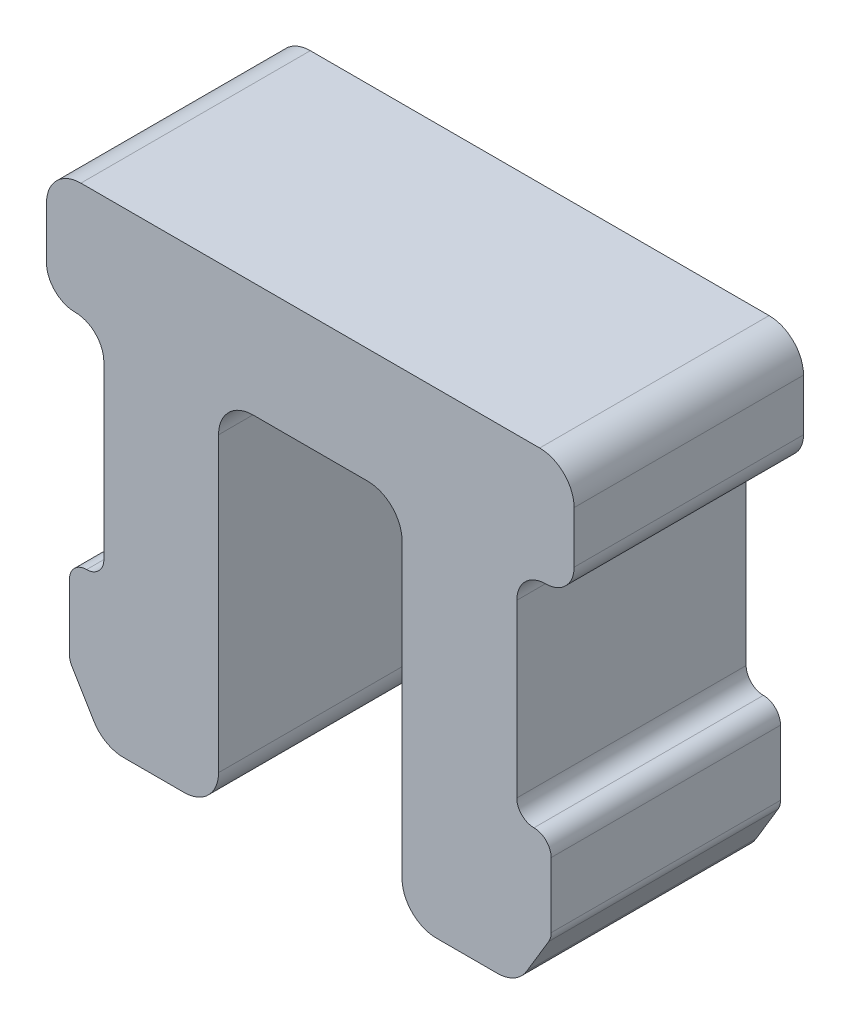
ISO-10303-21;
HEADER;
FILE_DESCRIPTION(('STEP AP214'),'2;1');
FILE_NAME('part.step','',(''),(''),'','','');
FILE_SCHEMA(('AUTOMOTIVE_DESIGN { 1 0 10303 214 1 1 1 1 }'));
ENDSEC;
DATA;
#1=APPLICATION_CONTEXT('core data for automotive mechanical design processes');
#2=APPLICATION_PROTOCOL_DEFINITION('international standard','automotive_design',2000,#1);
#3=PRODUCT_CONTEXT('',#1,'mechanical');
#4=PRODUCT('Part','Part','',(#3));
#5=PRODUCT_RELATED_PRODUCT_CATEGORY('part','',(#4));
#6=PRODUCT_DEFINITION_FORMATION('','',#4);
#7=PRODUCT_DEFINITION_CONTEXT('part definition',#1,'design');
#8=PRODUCT_DEFINITION('design','',#6,#7);
#9=PRODUCT_DEFINITION_SHAPE('','',#8);
#10=(LENGTH_UNIT() NAMED_UNIT(*) SI_UNIT(.MILLI.,.METRE.));
#11=(NAMED_UNIT(*) PLANE_ANGLE_UNIT() SI_UNIT($,.RADIAN.));
#12=(NAMED_UNIT(*) SI_UNIT($,.STERADIAN.) SOLID_ANGLE_UNIT());
#13=UNCERTAINTY_MEASURE_WITH_UNIT(LENGTH_MEASURE(1.E-05),#10,'distance_accuracy_value','');
#14=(GEOMETRIC_REPRESENTATION_CONTEXT(3) GLOBAL_UNCERTAINTY_ASSIGNED_CONTEXT((#13)) GLOBAL_UNIT_ASSIGNED_CONTEXT((#10,
#11,#12)) REPRESENTATION_CONTEXT('',''));
#15=CARTESIAN_POINT('',(0.,0.,0.));
#16=DIRECTION('',(0.,0.,1.));
#17=DIRECTION('',(1.,0.,0.));
#18=AXIS2_PLACEMENT_3D('',#15,#16,#17);
#19=CARTESIAN_POINT('',(-23.,0.,20.));
#20=DIRECTION('',(1.,0.,0.));
#21=DIRECTION('',(0.,1.,0.));
#22=AXIS2_PLACEMENT_3D('',#19,#20,#21);
#23=PLANE('',#22);
#24=DIRECTION('',(0.,-1.,0.));
#25=VECTOR('',#24,1.);
#26=CARTESIAN_POINT('',(-23.,0.,0.));
#27=LINE('',#26,#25);
#28=CARTESIAN_POINT('',(-23.,-3.,0.));
#29=VERTEX_POINT('',#28);
#30=CARTESIAN_POINT('',(-23.,-7.5,0.));
#31=VERTEX_POINT('',#30);
#32=EDGE_CURVE('E393',#29,#31,#27,.T.);
#33=ORIENTED_EDGE('',*,*,#32,.T.);
#34=DIRECTION('',(0.,0.,-1.));
#35=VECTOR('',#34,1.);
#36=CARTESIAN_POINT('',(-23.,-7.5,20.));
#37=LINE('',#36,#35);
#38=CARTESIAN_POINT('',(-23.,-7.5,20.));
#39=VERTEX_POINT('',#38);
#40=EDGE_CURVE('E430',#31,#39,#37,.F.);
#41=ORIENTED_EDGE('',*,*,#40,.T.);
#42=DIRECTION('',(0.,-1.,0.));
#43=VECTOR('',#42,1.);
#44=CARTESIAN_POINT('',(-23.,0.,20.));
#45=LINE('',#44,#43);
#46=CARTESIAN_POINT('',(-23.,-3.,20.));
#47=VERTEX_POINT('',#46);
#48=EDGE_CURVE('E292',#47,#39,#45,.T.);
#49=ORIENTED_EDGE('',*,*,#48,.F.);
#50=DIRECTION('',(0.,0.,-1.));
#51=VECTOR('',#50,1.);
#52=CARTESIAN_POINT('',(-23.,-3.,20.));
#53=LINE('',#52,#51);
#54=EDGE_CURVE('E316',#47,#29,#53,.T.);
#55=ORIENTED_EDGE('',*,*,#54,.T.);
#56=EDGE_LOOP('',(#33,#41,#49,#55));
#57=FACE_BOUND('',#56,.T.);
#58=ADVANCED_FACE('F39',(#57),#23,.F.);
#59=CARTESIAN_POINT('',(-18.,-10.,20.));
#60=DIRECTION('',(1.,0.,0.));
#61=DIRECTION('',(0.,1.,0.));
#62=AXIS2_PLACEMENT_3D('',#59,#60,#61);
#63=PLANE('',#62);
#64=DIRECTION('',(0.,-1.,0.));
#65=VECTOR('',#64,1.);
#66=CARTESIAN_POINT('',(-18.,-10.,20.));
#67=LINE('',#66,#65);
#68=CARTESIAN_POINT('',(-18.,-12.5,20.));
#69=VERTEX_POINT('',#68);
#70=CARTESIAN_POINT('',(-18.,-27.4256499190893,20.));
#71=VERTEX_POINT('',#70);
#72=EDGE_CURVE('E455',#69,#71,#67,.T.);
#73=ORIENTED_EDGE('',*,*,#72,.F.);
#74=DIRECTION('',(0.,0.,-1.));
#75=VECTOR('',#74,1.);
#76=CARTESIAN_POINT('',(-18.,-12.5,0.));
#77=LINE('',#76,#75);
#78=CARTESIAN_POINT('',(-18.,-12.5,0.));
#79=VERTEX_POINT('',#78);
#80=EDGE_CURVE('E427',#69,#79,#77,.T.);
#81=ORIENTED_EDGE('',*,*,#80,.T.);
#82=DIRECTION('',(0.,-1.,0.));
#83=VECTOR('',#82,1.);
#84=CARTESIAN_POINT('',(-18.,-10.,0.));
#85=LINE('',#84,#83);
#86=CARTESIAN_POINT('',(-18.,-27.4256499190893,0.));
#87=VERTEX_POINT('',#86);
#88=EDGE_CURVE('E451',#79,#87,#85,.T.);
#89=ORIENTED_EDGE('',*,*,#88,.T.);
#90=DIRECTION('',(0.,0.,-1.));
#91=VECTOR('',#90,1.);
#92=CARTESIAN_POINT('',(-18.,-27.4256499190893,20.));
#93=LINE('',#92,#91);
#94=EDGE_CURVE('E345',#87,#71,#93,.F.);
#95=ORIENTED_EDGE('',*,*,#94,.T.);
#96=EDGE_LOOP('',(#73,#81,#89,#95));
#97=FACE_BOUND('',#96,.T.);
#98=ADVANCED_FACE('F454',(#97),#63,.F.);
#99=CARTESIAN_POINT('',(-21.,-28.9256499190893,20.));
#100=DIRECTION('',(1.,0.,0.));
#101=DIRECTION('',(0.,1.,0.));
#102=AXIS2_PLACEMENT_3D('',#99,#100,#101);
#103=PLANE('',#102);
#104=DIRECTION('',(0.,-1.,0.));
#105=VECTOR('',#104,1.);
#106=CARTESIAN_POINT('',(-21.,-28.9256499190893,20.));
#107=LINE('',#106,#105);
#108=CARTESIAN_POINT('',(-21.,-30.4256499190893,20.));
#109=VERTEX_POINT('',#108);
#110=CARTESIAN_POINT('',(-21.,-36.0971304934058,20.));
#111=VERTEX_POINT('',#110);
#112=EDGE_CURVE('E874',#109,#111,#107,.T.);
#113=ORIENTED_EDGE('',*,*,#112,.F.);
#114=DIRECTION('',(0.,0.,-1.));
#115=VECTOR('',#114,1.);
#116=CARTESIAN_POINT('',(-21.,-30.4256499190893,20.));
#117=LINE('',#116,#115);
#118=CARTESIAN_POINT('',(-21.,-30.4256499190893,0.));
#119=VERTEX_POINT('',#118);
#120=EDGE_CURVE('E349',#109,#119,#117,.T.);
#121=ORIENTED_EDGE('',*,*,#120,.T.);
#122=DIRECTION('',(0.,-1.,0.));
#123=VECTOR('',#122,1.);
#124=CARTESIAN_POINT('',(-21.,-28.9256499190893,0.));
#125=LINE('',#124,#123);
#126=CARTESIAN_POINT('',(-21.,-36.0971304934058,0.));
#127=VERTEX_POINT('',#126);
#128=EDGE_CURVE('E456',#119,#127,#125,.T.);
#129=ORIENTED_EDGE('',*,*,#128,.T.);
#130=DIRECTION('',(0.,0.,-1.));
#131=VECTOR('',#130,1.);
#132=CARTESIAN_POINT('',(-21.,-36.0971304934058,20.));
#133=LINE('',#132,#131);
#134=EDGE_CURVE('E346',#127,#111,#133,.F.);
#135=ORIENTED_EDGE('',*,*,#134,.T.);
#136=EDGE_LOOP('',(#113,#121,#129,#135));
#137=FACE_BOUND('',#136,.T.);
#138=ADVANCED_FACE('F576',(#137),#103,.F.);
#139=CARTESIAN_POINT('',(-21.,-36.5126064408285,20.));
#140=DIRECTION('',(0.857492925712544,0.514495755427527,0.));
#141=DIRECTION('',(-0.514495755427527,0.857492925712544,0.));
#142=AXIS2_PLACEMENT_3D('',#139,#140,#141);
#143=PLANE('',#142);
#144=DIRECTION('',(0.514495755427527,-0.857492925712544,0.));
#145=VECTOR('',#144,1.);
#146=CARTESIAN_POINT('',(-21.,-36.5126064408285,0.));
#147=LINE('',#146,#145);
#148=CARTESIAN_POINT('',(-20.7862393885688,-36.8688741265471,0.));
#149=VERTEX_POINT('',#148);
#150=CARTESIAN_POINT('',(-18.8739076402304,-40.056093707111,0.));
#151=VERTEX_POINT('',#150);
#152=EDGE_CURVE('E458',#149,#151,#147,.T.);
#153=ORIENTED_EDGE('',*,*,#152,.T.);
#154=DIRECTION('',(0.,0.,-1.));
#155=VECTOR('',#154,1.);
#156=CARTESIAN_POINT('',(-18.8739076402304,-40.056093707111,20.));
#157=LINE('',#156,#155);
#158=CARTESIAN_POINT('',(-18.8739076402304,-40.056093707111,20.));
#159=VERTEX_POINT('',#158);
#160=EDGE_CURVE('E404',#151,#159,#157,.F.);
#161=ORIENTED_EDGE('',*,*,#160,.T.);
#162=DIRECTION('',(0.514495755427527,-0.857492925712544,0.));
#163=VECTOR('',#162,1.);
#164=CARTESIAN_POINT('',(-21.,-36.5126064408285,20.));
#165=LINE('',#164,#163);
#166=CARTESIAN_POINT('',(-20.7862393885688,-36.8688741265471,20.));
#167=VERTEX_POINT('',#166);
#168=EDGE_CURVE('E868',#167,#159,#165,.T.);
#169=ORIENTED_EDGE('',*,*,#168,.F.);
#170=DIRECTION('',(0.,0.,-1.));
#171=VECTOR('',#170,1.);
#172=CARTESIAN_POINT('',(-20.7862393885688,-36.8688741265471,20.));
#173=LINE('',#172,#171);
#174=EDGE_CURVE('E370',#167,#149,#173,.T.);
#175=ORIENTED_EDGE('',*,*,#174,.T.);
#176=EDGE_LOOP('',(#153,#161,#169,#175));
#177=FACE_BOUND('',#176,.T.);
#178=ADVANCED_FACE('F622',(#177),#143,.F.);
#179=CARTESIAN_POINT('',(-18.,-41.5126064408284,20.));
#180=DIRECTION('',(0.,1.,0.));
#181=DIRECTION('',(0.,0.,1.));
#182=AXIS2_PLACEMENT_3D('',#179,#180,#181);
#183=PLANE('',#182);
#184=DIRECTION('',(1.,0.,0.));
#185=VECTOR('',#184,1.);
#186=CARTESIAN_POINT('',(-18.,-41.5126064408284,20.));
#187=LINE('',#186,#185);
#188=CARTESIAN_POINT('',(-16.3014288630928,-41.5126064408284,20.));
#189=VERTEX_POINT('',#188);
#190=CARTESIAN_POINT('',(-11.,-41.5126064408284,20.));
#191=VERTEX_POINT('',#190);
#192=EDGE_CURVE('E856',#189,#191,#187,.T.);
#193=ORIENTED_EDGE('',*,*,#192,.F.);
#194=DIRECTION('',(0.,0.,-1.));
#195=VECTOR('',#194,1.);
#196=CARTESIAN_POINT('',(-16.3014288630928,-41.5126064408284,20.));
#197=LINE('',#196,#195);
#198=CARTESIAN_POINT('',(-16.3014288630928,-41.5126064408284,0.));
#199=VERTEX_POINT('',#198);
#200=EDGE_CURVE('E387',#189,#199,#197,.T.);
#201=ORIENTED_EDGE('',*,*,#200,.T.);
#202=DIRECTION('',(1.,0.,0.));
#203=VECTOR('',#202,1.);
#204=CARTESIAN_POINT('',(-18.,-41.5126064408284,0.));
#205=LINE('',#204,#203);
#206=CARTESIAN_POINT('',(-11.,-41.5126064408284,0.));
#207=VERTEX_POINT('',#206);
#208=EDGE_CURVE('E470',#199,#207,#205,.T.);
#209=ORIENTED_EDGE('',*,*,#208,.T.);
#210=DIRECTION('',(0.,0.,-1.));
#211=VECTOR('',#210,1.);
#212=CARTESIAN_POINT('',(-11.,-41.5126064408284,20.));
#213=LINE('',#212,#211);
#214=EDGE_CURVE('E317',#207,#191,#213,.F.);
#215=ORIENTED_EDGE('',*,*,#214,.T.);
#216=EDGE_LOOP('',(#193,#201,#209,#215));
#217=FACE_BOUND('',#216,.T.);
#218=ADVANCED_FACE('F627',(#217),#183,.F.);
#219=CARTESIAN_POINT('',(-7.99999999999999,-41.5126064408284,20.));
#220=DIRECTION('',(-1.,0.,0.));
#221=DIRECTION('',(0.,-1.,0.));
#222=AXIS2_PLACEMENT_3D('',#219,#220,#221);
#223=PLANE('',#222);
#224=DIRECTION('',(0.,1.,0.));
#225=VECTOR('',#224,1.);
#226=CARTESIAN_POINT('',(-7.99999999999999,-41.5126064408284,20.));
#227=LINE('',#226,#225);
#228=CARTESIAN_POINT('',(-7.99999999999999,-38.5126064408284,20.));
#229=VERTEX_POINT('',#228);
#230=CARTESIAN_POINT('',(-7.99999999999999,-13.,20.));
#231=VERTEX_POINT('',#230);
#232=EDGE_CURVE('E494',#229,#231,#227,.T.);
#233=ORIENTED_EDGE('',*,*,#232,.F.);
#234=DIRECTION('',(0.,0.,-1.));
#235=VECTOR('',#234,1.);
#236=CARTESIAN_POINT('',(-7.99999999999999,-38.5126064408284,20.));
#237=LINE('',#236,#235);
#238=CARTESIAN_POINT('',(-7.99999999999999,-38.5126064408284,0.));
#239=VERTEX_POINT('',#238);
#240=EDGE_CURVE('E312',#229,#239,#237,.T.);
#241=ORIENTED_EDGE('',*,*,#240,.T.);
#242=DIRECTION('',(0.,1.,0.));
#243=VECTOR('',#242,1.);
#244=CARTESIAN_POINT('',(-7.99999999999999,-41.5126064408284,0.));
#245=LINE('',#244,#243);
#246=CARTESIAN_POINT('',(-7.99999999999999,-13.,0.));
#247=VERTEX_POINT('',#246);
#248=EDGE_CURVE('E469',#239,#247,#245,.T.);
#249=ORIENTED_EDGE('',*,*,#248,.T.);
#250=DIRECTION('',(0.,0.,-1.));
#251=VECTOR('',#250,1.);
#252=CARTESIAN_POINT('',(-7.99999999999999,-13.,20.));
#253=LINE('',#252,#251);
#254=EDGE_CURVE('E311',#247,#231,#253,.F.);
#255=ORIENTED_EDGE('',*,*,#254,.T.);
#256=EDGE_LOOP('',(#233,#241,#249,#255));
#257=FACE_BOUND('',#256,.T.);
#258=ADVANCED_FACE('F638',(#257),#223,.F.);
#259=CARTESIAN_POINT('',(-7.99999999999999,-10.,20.));
#260=DIRECTION('',(0.,1.,0.));
#261=DIRECTION('',(-1.,0.,0.));
#262=AXIS2_PLACEMENT_3D('',#259,#260,#261);
#263=PLANE('',#262);
#264=DIRECTION('',(1.,0.,0.));
#265=VECTOR('',#264,1.);
#266=CARTESIAN_POINT('',(-7.99999999999999,-10.,20.));
#267=LINE('',#266,#265);
#268=CARTESIAN_POINT('',(-4.99999999999999,-10.,20.));
#269=VERTEX_POINT('',#268);
#270=CARTESIAN_POINT('',(5.,-10.,20.));
#271=VERTEX_POINT('',#270);
#272=EDGE_CURVE('E486',#269,#271,#267,.T.);
#273=ORIENTED_EDGE('',*,*,#272,.F.);
#274=DIRECTION('',(0.,0.,-1.));
#275=VECTOR('',#274,1.);
#276=CARTESIAN_POINT('',(-4.99999999999999,-10.,0.));
#277=LINE('',#276,#275);
#278=CARTESIAN_POINT('',(-4.99999999999999,-10.,0.));
#279=VERTEX_POINT('',#278);
#280=EDGE_CURVE('E332',#269,#279,#277,.T.);
#281=ORIENTED_EDGE('',*,*,#280,.T.);
#282=DIRECTION('',(1.,0.,0.));
#283=VECTOR('',#282,1.);
#284=CARTESIAN_POINT('',(-7.99999999999999,-10.,0.));
#285=LINE('',#284,#283);
#286=CARTESIAN_POINT('',(5.,-10.,0.));
#287=VERTEX_POINT('',#286);
#288=EDGE_CURVE('E278',#279,#287,#285,.T.);
#289=ORIENTED_EDGE('',*,*,#288,.T.);
#290=DIRECTION('',(0.,0.,-1.));
#291=VECTOR('',#290,1.);
#292=CARTESIAN_POINT('',(5.,-10.,20.));
#293=LINE('',#292,#291);
#294=EDGE_CURVE('E330',#287,#271,#293,.F.);
#295=ORIENTED_EDGE('',*,*,#294,.T.);
#296=EDGE_LOOP('',(#273,#281,#289,#295));
#297=FACE_BOUND('',#296,.T.);
#298=ADVANCED_FACE('F476',(#297),#263,.F.);
#299=CARTESIAN_POINT('',(8.00000000000001,-41.5126064408284,20.));
#300=DIRECTION('',(1.,0.,0.));
#301=DIRECTION('',(0.,1.,0.));
#302=AXIS2_PLACEMENT_3D('',#299,#300,#301);
#303=PLANE('',#302);
#304=DIRECTION('',(0.,-1.,0.));
#305=VECTOR('',#304,1.);
#306=CARTESIAN_POINT('',(8.00000000000001,-41.5126064408284,0.));
#307=LINE('',#306,#305);
#308=CARTESIAN_POINT('',(8.,-13.,0.));
#309=VERTEX_POINT('',#308);
#310=CARTESIAN_POINT('',(8.00000000000001,-38.5126064408284,0.));
#311=VERTEX_POINT('',#310);
#312=EDGE_CURVE('E273',#309,#311,#307,.T.);
#313=ORIENTED_EDGE('',*,*,#312,.T.);
#314=DIRECTION('',(0.,0.,-1.));
#315=VECTOR('',#314,1.);
#316=CARTESIAN_POINT('',(8.00000000000001,-38.5126064408284,20.));
#317=LINE('',#316,#315);
#318=CARTESIAN_POINT('',(8.00000000000001,-38.5126064408284,20.));
#319=VERTEX_POINT('',#318);
#320=EDGE_CURVE('E252',#311,#319,#317,.F.);
#321=ORIENTED_EDGE('',*,*,#320,.T.);
#322=DIRECTION('',(0.,-1.,0.));
#323=VECTOR('',#322,1.);
#324=CARTESIAN_POINT('',(8.00000000000001,-41.5126064408284,20.));
#325=LINE('',#324,#323);
#326=CARTESIAN_POINT('',(8.,-13.,20.));
#327=VERTEX_POINT('',#326);
#328=EDGE_CURVE('E487',#327,#319,#325,.T.);
#329=ORIENTED_EDGE('',*,*,#328,.F.);
#330=DIRECTION('',(0.,0.,-1.));
#331=VECTOR('',#330,1.);
#332=CARTESIAN_POINT('',(8.,-13.,0.));
#333=LINE('',#332,#331);
#334=EDGE_CURVE('E259',#327,#309,#333,.T.);
#335=ORIENTED_EDGE('',*,*,#334,.T.);
#336=EDGE_LOOP('',(#313,#321,#329,#335));
#337=FACE_BOUND('',#336,.T.);
#338=ADVANCED_FACE('F489',(#337),#303,.F.);
#339=CARTESIAN_POINT('',(18.,-41.5126064408284,20.));
#340=DIRECTION('',(0.,1.,0.));
#341=DIRECTION('',(-1.,0.,0.));
#342=AXIS2_PLACEMENT_3D('',#339,#340,#341);
#343=PLANE('',#342);
#344=DIRECTION('',(1.,0.,0.));
#345=VECTOR('',#344,1.);
#346=CARTESIAN_POINT('',(18.,-41.5126064408284,0.));
#347=LINE('',#346,#345);
#348=CARTESIAN_POINT('',(11.,-41.5126064408284,0.));
#349=VERTEX_POINT('',#348);
#350=CARTESIAN_POINT('',(16.3014288630928,-41.5126064408284,0.));
#351=VERTEX_POINT('',#350);
#352=EDGE_CURVE('E264',#349,#351,#347,.T.);
#353=ORIENTED_EDGE('',*,*,#352,.T.);
#354=DIRECTION('',(0.,0.,-1.));
#355=VECTOR('',#354,1.);
#356=CARTESIAN_POINT('',(16.3014288630928,-41.5126064408284,20.));
#357=LINE('',#356,#355);
#358=CARTESIAN_POINT('',(16.3014288630928,-41.5126064408284,20.));
#359=VERTEX_POINT('',#358);
#360=EDGE_CURVE('E414',#351,#359,#357,.F.);
#361=ORIENTED_EDGE('',*,*,#360,.T.);
#362=DIRECTION('',(1.,0.,0.));
#363=VECTOR('',#362,1.);
#364=CARTESIAN_POINT('',(18.,-41.5126064408284,20.));
#365=LINE('',#364,#363);
#366=CARTESIAN_POINT('',(11.,-41.5126064408284,20.));
#367=VERTEX_POINT('',#366);
#368=EDGE_CURVE('E266',#367,#359,#365,.T.);
#369=ORIENTED_EDGE('',*,*,#368,.F.);
#370=DIRECTION('',(0.,0.,-1.));
#371=VECTOR('',#370,1.);
#372=CARTESIAN_POINT('',(11.,-41.5126064408284,20.));
#373=LINE('',#372,#371);
#374=EDGE_CURVE('E249',#367,#349,#373,.T.);
#375=ORIENTED_EDGE('',*,*,#374,.T.);
#376=EDGE_LOOP('',(#353,#361,#369,#375));
#377=FACE_BOUND('',#376,.T.);
#378=ADVANCED_FACE('F262',(#377),#343,.F.);
#379=CARTESIAN_POINT('',(21.,-36.5126064408284,20.));
#380=DIRECTION('',(-0.857492925712544,0.514495755427527,0.));
#381=DIRECTION('',(-0.514495755427527,-0.857492925712544,0.));
#382=AXIS2_PLACEMENT_3D('',#379,#380,#381);
#383=PLANE('',#382);
#384=DIRECTION('',(0.514495755427527,0.857492925712544,0.));
#385=VECTOR('',#384,1.);
#386=CARTESIAN_POINT('',(21.,-36.5126064408284,20.));
#387=LINE('',#386,#385);
#388=CARTESIAN_POINT('',(18.8739076402305,-40.056093707111,20.));
#389=VERTEX_POINT('',#388);
#390=CARTESIAN_POINT('',(20.7862393885688,-36.8688741265471,20.));
#391=VERTEX_POINT('',#390);
#392=EDGE_CURVE('E495',#389,#391,#387,.T.);
#393=ORIENTED_EDGE('',*,*,#392,.F.);
#394=DIRECTION('',(0.,0.,-1.));
#395=VECTOR('',#394,1.);
#396=CARTESIAN_POINT('',(18.8739076402305,-40.056093707111,20.));
#397=LINE('',#396,#395);
#398=CARTESIAN_POINT('',(18.8739076402305,-40.056093707111,0.));
#399=VERTEX_POINT('',#398);
#400=EDGE_CURVE('E407',#389,#399,#397,.T.);
#401=ORIENTED_EDGE('',*,*,#400,.T.);
#402=DIRECTION('',(0.514495755427527,0.857492925712544,0.));
#403=VECTOR('',#402,1.);
#404=CARTESIAN_POINT('',(21.,-36.5126064408284,0.));
#405=LINE('',#404,#403);
#406=CARTESIAN_POINT('',(20.7862393885688,-36.8688741265471,0.));
#407=VERTEX_POINT('',#406);
#408=EDGE_CURVE('E274',#399,#407,#405,.T.);
#409=ORIENTED_EDGE('',*,*,#408,.T.);
#410=DIRECTION('',(0.,0.,-1.));
#411=VECTOR('',#410,1.);
#412=CARTESIAN_POINT('',(20.7862393885688,-36.8688741265471,20.));
#413=LINE('',#412,#411);
#414=EDGE_CURVE('E377',#407,#391,#413,.F.);
#415=ORIENTED_EDGE('',*,*,#414,.T.);
#416=EDGE_LOOP('',(#393,#401,#409,#415));
#417=FACE_BOUND('',#416,.T.);
#418=ADVANCED_FACE('F556',(#417),#383,.F.);
#419=CARTESIAN_POINT('',(21.,-28.9256499190893,20.));
#420=DIRECTION('',(-1.,0.,0.));
#421=DIRECTION('',(0.,-1.,0.));
#422=AXIS2_PLACEMENT_3D('',#419,#420,#421);
#423=PLANE('',#422);
#424=DIRECTION('',(0.,1.,0.));
#425=VECTOR('',#424,1.);
#426=CARTESIAN_POINT('',(21.,-28.9256499190893,0.));
#427=LINE('',#426,#425);
#428=CARTESIAN_POINT('',(21.,-36.0971304934058,0.));
#429=VERTEX_POINT('',#428);
#430=CARTESIAN_POINT('',(21.,-30.4256499190893,0.));
#431=VERTEX_POINT('',#430);
#432=EDGE_CURVE('E276',#429,#431,#427,.T.);
#433=ORIENTED_EDGE('',*,*,#432,.T.);
#434=DIRECTION('',(0.,0.,-1.));
#435=VECTOR('',#434,1.);
#436=CARTESIAN_POINT('',(21.,-30.4256499190893,20.));
#437=LINE('',#436,#435);
#438=CARTESIAN_POINT('',(21.,-30.4256499190893,20.));
#439=VERTEX_POINT('',#438);
#440=EDGE_CURVE('E376',#431,#439,#437,.F.);
#441=ORIENTED_EDGE('',*,*,#440,.T.);
#442=DIRECTION('',(0.,1.,0.));
#443=VECTOR('',#442,1.);
#444=CARTESIAN_POINT('',(21.,-28.9256499190893,20.));
#445=LINE('',#444,#443);
#446=CARTESIAN_POINT('',(21.,-36.0971304934058,20.));
#447=VERTEX_POINT('',#446);
#448=EDGE_CURVE('E497',#447,#439,#445,.T.);
#449=ORIENTED_EDGE('',*,*,#448,.F.);
#450=DIRECTION('',(0.,0.,-1.));
#451=VECTOR('',#450,1.);
#452=CARTESIAN_POINT('',(21.,-36.0971304934058,20.));
#453=LINE('',#452,#451);
#454=EDGE_CURVE('E373',#447,#429,#453,.T.);
#455=ORIENTED_EDGE('',*,*,#454,.T.);
#456=EDGE_LOOP('',(#433,#441,#449,#455));
#457=FACE_BOUND('',#456,.T.);
#458=ADVANCED_FACE('F550',(#457),#423,.F.);
#459=CARTESIAN_POINT('',(18.,-9.99999999999999,20.));
#460=DIRECTION('',(-1.,0.,0.));
#461=DIRECTION('',(0.,-1.,0.));
#462=AXIS2_PLACEMENT_3D('',#459,#460,#461);
#463=PLANE('',#462);
#464=DIRECTION('',(0.,1.,0.));
#465=VECTOR('',#464,1.);
#466=CARTESIAN_POINT('',(18.,-9.99999999999999,0.));
#467=LINE('',#466,#465);
#468=CARTESIAN_POINT('',(18.,-27.4256499190893,0.));
#469=VERTEX_POINT('',#468);
#470=CARTESIAN_POINT('',(18.,-12.5,0.));
#471=VERTEX_POINT('',#470);
#472=EDGE_CURVE('E285',#469,#471,#467,.T.);
#473=ORIENTED_EDGE('',*,*,#472,.T.);
#474=DIRECTION('',(0.,0.,-1.));
#475=VECTOR('',#474,1.);
#476=CARTESIAN_POINT('',(18.,-12.5,20.));
#477=LINE('',#476,#475);
#478=CARTESIAN_POINT('',(18.,-12.5,20.));
#479=VERTEX_POINT('',#478);
#480=EDGE_CURVE('E424',#471,#479,#477,.F.);
#481=ORIENTED_EDGE('',*,*,#480,.T.);
#482=DIRECTION('',(0.,1.,0.));
#483=VECTOR('',#482,1.);
#484=CARTESIAN_POINT('',(18.,-9.99999999999999,20.));
#485=LINE('',#484,#483);
#486=CARTESIAN_POINT('',(18.,-27.4256499190893,20.));
#487=VERTEX_POINT('',#486);
#488=EDGE_CURVE('E505',#487,#479,#485,.T.);
#489=ORIENTED_EDGE('',*,*,#488,.F.);
#490=DIRECTION('',(0.,0.,-1.));
#491=VECTOR('',#490,1.);
#492=CARTESIAN_POINT('',(18.,-27.4256499190893,0.));
#493=LINE('',#492,#491);
#494=EDGE_CURVE('E369',#487,#469,#493,.T.);
#495=ORIENTED_EDGE('',*,*,#494,.T.);
#496=EDGE_LOOP('',(#473,#481,#489,#495));
#497=FACE_BOUND('',#496,.T.);
#498=ADVANCED_FACE('F539',(#497),#463,.F.);
#499=CARTESIAN_POINT('',(23.,0.,20.));
#500=DIRECTION('',(-1.,0.,0.));
#501=DIRECTION('',(0.,-1.,0.));
#502=AXIS2_PLACEMENT_3D('',#499,#500,#501);
#503=PLANE('',#502);
#504=DIRECTION('',(0.,1.,0.));
#505=VECTOR('',#504,1.);
#506=CARTESIAN_POINT('',(23.,0.,20.));
#507=LINE('',#506,#505);
#508=CARTESIAN_POINT('',(23.,-7.49999999999999,20.));
#509=VERTEX_POINT('',#508);
#510=CARTESIAN_POINT('',(23.,-3.,20.));
#511=VERTEX_POINT('',#510);
#512=EDGE_CURVE('E502',#509,#511,#507,.T.);
#513=ORIENTED_EDGE('',*,*,#512,.F.);
#514=DIRECTION('',(0.,0.,-1.));
#515=VECTOR('',#514,1.);
#516=CARTESIAN_POINT('',(23.,-7.49999999999999,20.));
#517=LINE('',#516,#515);
#518=CARTESIAN_POINT('',(23.,-7.49999999999999,0.));
#519=VERTEX_POINT('',#518);
#520=EDGE_CURVE('E415',#509,#519,#517,.T.);
#521=ORIENTED_EDGE('',*,*,#520,.T.);
#522=DIRECTION('',(0.,1.,0.));
#523=VECTOR('',#522,1.);
#524=CARTESIAN_POINT('',(23.,0.,0.));
#525=LINE('',#524,#523);
#526=CARTESIAN_POINT('',(23.,-3.,0.));
#527=VERTEX_POINT('',#526);
#528=EDGE_CURVE('E289',#519,#527,#525,.T.);
#529=ORIENTED_EDGE('',*,*,#528,.T.);
#530=DIRECTION('',(0.,0.,-1.));
#531=VECTOR('',#530,1.);
#532=CARTESIAN_POINT('',(23.,-3.,20.));
#533=LINE('',#532,#531);
#534=EDGE_CURVE('E327',#527,#511,#533,.F.);
#535=ORIENTED_EDGE('',*,*,#534,.T.);
#536=EDGE_LOOP('',(#513,#521,#529,#535));
#537=FACE_BOUND('',#536,.T.);
#538=ADVANCED_FACE('F526',(#537),#503,.F.);
#539=CARTESIAN_POINT('',(23.,0.,20.));
#540=DIRECTION('',(0.,-1.,0.));
#541=DIRECTION('',(1.,0.,0.));
#542=AXIS2_PLACEMENT_3D('',#539,#540,#541);
#543=PLANE('',#542);
#544=DIRECTION('',(-1.,0.,0.));
#545=VECTOR('',#544,1.);
#546=CARTESIAN_POINT('',(23.,0.,0.));
#547=LINE('',#546,#545);
#548=CARTESIAN_POINT('',(20.,0.,0.));
#549=VERTEX_POINT('',#548);
#550=CARTESIAN_POINT('',(-20.,0.,0.));
#551=VERTEX_POINT('',#550);
#552=EDGE_CURVE('E290',#549,#551,#547,.T.);
#553=ORIENTED_EDGE('',*,*,#552,.T.);
#554=DIRECTION('',(0.,0.,-1.));
#555=VECTOR('',#554,1.);
#556=CARTESIAN_POINT('',(-20.,0.,20.));
#557=LINE('',#556,#555);
#558=CARTESIAN_POINT('',(-20.,0.,20.));
#559=VERTEX_POINT('',#558);
#560=EDGE_CURVE('E322',#551,#559,#557,.F.);
#561=ORIENTED_EDGE('',*,*,#560,.T.);
#562=DIRECTION('',(-1.,0.,0.));
#563=VECTOR('',#562,1.);
#564=CARTESIAN_POINT('',(23.,0.,20.));
#565=LINE('',#564,#563);
#566=CARTESIAN_POINT('',(20.,0.,20.));
#567=VERTEX_POINT('',#566);
#568=EDGE_CURVE('E269',#567,#559,#565,.T.);
#569=ORIENTED_EDGE('',*,*,#568,.F.);
#570=DIRECTION('',(0.,0.,-1.));
#571=VECTOR('',#570,1.);
#572=CARTESIAN_POINT('',(20.,0.,20.));
#573=LINE('',#572,#571);
#574=EDGE_CURVE('E321',#567,#549,#573,.T.);
#575=ORIENTED_EDGE('',*,*,#574,.T.);
#576=EDGE_LOOP('',(#553,#561,#569,#575));
#577=FACE_BOUND('',#576,.T.);
#578=ADVANCED_FACE('F518',(#577),#543,.F.);
#579=CARTESIAN_POINT('',(0.,0.,20.));
#580=DIRECTION('',(0.,0.,1.));
#581=DIRECTION('',(1.,0.,0.));
#582=AXIS2_PLACEMENT_3D('',#579,#580,#581);
#583=PLANE('',#582);
#584=ORIENTED_EDGE('',*,*,#488,.T.);
#585=CARTESIAN_POINT('',(20.5,-12.5,20.));
#586=DIRECTION('',(0.,0.,1.));
#587=DIRECTION('',(1.,0.,0.));
#588=AXIS2_PLACEMENT_3D('',#585,#586,#587);
#589=CIRCLE('',#588,2.5);
#590=CARTESIAN_POINT('',(20.5,-9.99999999999999,20.));
#591=VERTEX_POINT('',#590);
#592=EDGE_CURVE('E432',#479,#591,#589,.F.);
#593=ORIENTED_EDGE('',*,*,#592,.T.);
#594=CARTESIAN_POINT('',(20.5,-7.49999999999999,20.));
#595=DIRECTION('',(0.,0.,1.));
#596=DIRECTION('',(1.,0.,0.));
#597=AXIS2_PLACEMENT_3D('',#594,#595,#596);
#598=CIRCLE('',#597,2.5);
#599=EDGE_CURVE('E421',#591,#509,#598,.T.);
#600=ORIENTED_EDGE('',*,*,#599,.T.);
#601=ORIENTED_EDGE('',*,*,#512,.T.);
#602=CARTESIAN_POINT('',(20.,-3.,20.));
#603=DIRECTION('',(0.,0.,1.));
#604=DIRECTION('',(1.,0.,0.));
#605=AXIS2_PLACEMENT_3D('',#602,#603,#604);
#606=CIRCLE('',#605,3.);
#607=EDGE_CURVE('E303',#511,#567,#606,.T.);
#608=ORIENTED_EDGE('',*,*,#607,.T.);
#609=ORIENTED_EDGE('',*,*,#568,.T.);
#610=CARTESIAN_POINT('',(-20.,-3.00000000000001,20.));
#611=DIRECTION('',(0.,0.,1.));
#612=DIRECTION('',(1.,0.,0.));
#613=AXIS2_PLACEMENT_3D('',#610,#611,#612);
#614=CIRCLE('',#613,3.);
#615=EDGE_CURVE('E304',#559,#47,#614,.T.);
#616=ORIENTED_EDGE('',*,*,#615,.T.);
#617=ORIENTED_EDGE('',*,*,#48,.T.);
#618=CARTESIAN_POINT('',(-20.5,-7.5,20.));
#619=DIRECTION('',(0.,0.,1.));
#620=DIRECTION('',(1.,0.,0.));
#621=AXIS2_PLACEMENT_3D('',#618,#619,#620);
#622=CIRCLE('',#621,2.5);
#623=CARTESIAN_POINT('',(-20.5,-10.,20.));
#624=VERTEX_POINT('',#623);
#625=EDGE_CURVE('E56',#39,#624,#622,.T.);
#626=ORIENTED_EDGE('',*,*,#625,.T.);
#627=CARTESIAN_POINT('',(-20.5,-12.5,20.));
#628=DIRECTION('',(0.,0.,1.));
#629=DIRECTION('',(1.,0.,0.));
#630=AXIS2_PLACEMENT_3D('',#627,#628,#629);
#631=CIRCLE('',#630,2.5);
#632=EDGE_CURVE('E11',#624,#69,#631,.F.);
#633=ORIENTED_EDGE('',*,*,#632,.T.);
#634=ORIENTED_EDGE('',*,*,#72,.T.);
#635=CARTESIAN_POINT('',(-19.5,-27.4256499190893,20.));
#636=DIRECTION('',(0.,0.,1.));
#637=DIRECTION('',(1.,0.,0.));
#638=AXIS2_PLACEMENT_3D('',#635,#636,#637);
#639=CIRCLE('',#638,1.5);
#640=CARTESIAN_POINT('',(-19.5,-28.9256499190893,20.));
#641=VERTEX_POINT('',#640);
#642=EDGE_CURVE('E381',#71,#641,#639,.F.);
#643=ORIENTED_EDGE('',*,*,#642,.T.);
#644=CARTESIAN_POINT('',(-19.5,-30.4256499190893,20.));
#645=DIRECTION('',(0.,0.,1.));
#646=DIRECTION('',(1.,0.,0.));
#647=AXIS2_PLACEMENT_3D('',#644,#645,#646);
#648=CIRCLE('',#647,1.5);
#649=EDGE_CURVE('E362',#641,#109,#648,.T.);
#650=ORIENTED_EDGE('',*,*,#649,.T.);
#651=ORIENTED_EDGE('',*,*,#112,.T.);
#652=CARTESIAN_POINT('',(-19.5,-36.0971304934058,20.));
#653=DIRECTION('',(0.,0.,1.));
#654=DIRECTION('',(1.,0.,0.));
#655=AXIS2_PLACEMENT_3D('',#652,#653,#654);
#656=CIRCLE('',#655,1.5);
#657=EDGE_CURVE('E361',#111,#167,#656,.T.);
#658=ORIENTED_EDGE('',*,*,#657,.T.);
#659=ORIENTED_EDGE('',*,*,#168,.T.);
#660=CARTESIAN_POINT('',(-16.3014288630928,-38.5126064408284,20.));
#661=DIRECTION('',(0.,0.,1.));
#662=DIRECTION('',(1.,0.,0.));
#663=AXIS2_PLACEMENT_3D('',#660,#661,#662);
#664=CIRCLE('',#663,3.);
#665=EDGE_CURVE('E410',#159,#189,#664,.T.);
#666=ORIENTED_EDGE('',*,*,#665,.T.);
#667=ORIENTED_EDGE('',*,*,#192,.T.);
#668=CARTESIAN_POINT('',(-11.,-38.5126064408284,20.));
#669=DIRECTION('',(0.,0.,1.));
#670=DIRECTION('',(1.,0.,0.));
#671=AXIS2_PLACEMENT_3D('',#668,#669,#670);
#672=CIRCLE('',#671,3.);
#673=EDGE_CURVE('E310',#191,#229,#672,.T.);
#674=ORIENTED_EDGE('',*,*,#673,.T.);
#675=ORIENTED_EDGE('',*,*,#232,.T.);
#676=CARTESIAN_POINT('',(-4.99999999999999,-13.,20.));
#677=DIRECTION('',(0.,0.,1.));
#678=DIRECTION('',(1.,0.,0.));
#679=AXIS2_PLACEMENT_3D('',#676,#677,#678);
#680=CIRCLE('',#679,3.);
#681=EDGE_CURVE('E340',#231,#269,#680,.F.);
#682=ORIENTED_EDGE('',*,*,#681,.T.);
#683=ORIENTED_EDGE('',*,*,#272,.T.);
#684=CARTESIAN_POINT('',(5.,-13.,20.));
#685=DIRECTION('',(0.,0.,1.));
#686=DIRECTION('',(1.,0.,0.));
#687=AXIS2_PLACEMENT_3D('',#684,#685,#686);
#688=CIRCLE('',#687,3.);
#689=EDGE_CURVE('E344',#271,#327,#688,.F.);
#690=ORIENTED_EDGE('',*,*,#689,.T.);
#691=ORIENTED_EDGE('',*,*,#328,.T.);
#692=CARTESIAN_POINT('',(11.,-38.5126064408284,20.));
#693=DIRECTION('',(0.,0.,1.));
#694=DIRECTION('',(1.,0.,0.));
#695=AXIS2_PLACEMENT_3D('',#692,#693,#694);
#696=CIRCLE('',#695,3.);
#697=EDGE_CURVE('E307',#319,#367,#696,.T.);
#698=ORIENTED_EDGE('',*,*,#697,.T.);
#699=ORIENTED_EDGE('',*,*,#368,.T.);
#700=CARTESIAN_POINT('',(16.3014288630928,-38.5126064408284,20.));
#701=DIRECTION('',(0.,0.,1.));
#702=DIRECTION('',(1.,0.,0.));
#703=AXIS2_PLACEMENT_3D('',#700,#701,#702);
#704=CIRCLE('',#703,3.);
#705=EDGE_CURVE('E409',#359,#389,#704,.T.);
#706=ORIENTED_EDGE('',*,*,#705,.T.);
#707=ORIENTED_EDGE('',*,*,#392,.T.);
#708=CARTESIAN_POINT('',(19.5,-36.0971304934058,20.));
#709=DIRECTION('',(0.,0.,1.));
#710=DIRECTION('',(1.,0.,0.));
#711=AXIS2_PLACEMENT_3D('',#708,#709,#710);
#712=CIRCLE('',#711,1.5);
#713=EDGE_CURVE('E360',#391,#447,#712,.T.);
#714=ORIENTED_EDGE('',*,*,#713,.T.);
#715=ORIENTED_EDGE('',*,*,#448,.T.);
#716=CARTESIAN_POINT('',(19.5,-30.4256499190893,20.));
#717=DIRECTION('',(0.,0.,1.));
#718=DIRECTION('',(1.,0.,0.));
#719=AXIS2_PLACEMENT_3D('',#716,#717,#718);
#720=CIRCLE('',#719,1.5);
#721=CARTESIAN_POINT('',(19.5,-28.9256499190893,20.));
#722=VERTEX_POINT('',#721);
#723=EDGE_CURVE('E363',#439,#722,#720,.T.);
#724=ORIENTED_EDGE('',*,*,#723,.T.);
#725=CARTESIAN_POINT('',(19.5,-27.4256499190893,20.));
#726=DIRECTION('',(0.,0.,1.));
#727=DIRECTION('',(1.,0.,0.));
#728=AXIS2_PLACEMENT_3D('',#725,#726,#727);
#729=CIRCLE('',#728,1.5);
#730=EDGE_CURVE('E390',#722,#487,#729,.F.);
#731=ORIENTED_EDGE('',*,*,#730,.T.);
#732=EDGE_LOOP('',(#584,#593,#600,#601,#608,#609,#616,#617,#626,#633,#634,#643,#650,#651,#658,
#659,#666,#667,#674,#675,#682,#683,#690,#691,#698,#699,#706,#707,#714,#715,#724,#731));
#733=FACE_BOUND('',#732,.T.);
#734=ADVANCED_FACE('F488',(#733),#583,.T.);
#735=CARTESIAN_POINT('',(0.,0.,0.));
#736=DIRECTION('',(0.,0.,1.));
#737=DIRECTION('',(1.,0.,0.));
#738=AXIS2_PLACEMENT_3D('',#735,#736,#737);
#739=PLANE('',#738);
#740=ORIENTED_EDGE('',*,*,#528,.F.);
#741=CARTESIAN_POINT('',(20.5,-7.49999999999999,0.));
#742=DIRECTION('',(0.,0.,1.));
#743=DIRECTION('',(1.,0.,0.));
#744=AXIS2_PLACEMENT_3D('',#741,#742,#743);
#745=CIRCLE('',#744,2.5);
#746=CARTESIAN_POINT('',(20.5,-9.99999999999999,0.));
#747=VERTEX_POINT('',#746);
#748=EDGE_CURVE('E420',#519,#747,#745,.F.);
#749=ORIENTED_EDGE('',*,*,#748,.T.);
#750=CARTESIAN_POINT('',(20.5,-12.5,0.));
#751=DIRECTION('',(0.,0.,1.));
#752=DIRECTION('',(1.,0.,0.));
#753=AXIS2_PLACEMENT_3D('',#750,#751,#752);
#754=CIRCLE('',#753,2.5);
#755=EDGE_CURVE('E435',#747,#471,#754,.T.);
#756=ORIENTED_EDGE('',*,*,#755,.T.);
#757=ORIENTED_EDGE('',*,*,#472,.F.);
#758=CARTESIAN_POINT('',(19.5,-27.4256499190893,0.));
#759=DIRECTION('',(0.,0.,1.));
#760=DIRECTION('',(1.,0.,0.));
#761=AXIS2_PLACEMENT_3D('',#758,#759,#760);
#762=CIRCLE('',#761,1.5);
#763=CARTESIAN_POINT('',(19.5,-28.9256499190893,0.));
#764=VERTEX_POINT('',#763);
#765=EDGE_CURVE('E389',#469,#764,#762,.T.);
#766=ORIENTED_EDGE('',*,*,#765,.T.);
#767=CARTESIAN_POINT('',(19.5,-30.4256499190893,0.));
#768=DIRECTION('',(0.,0.,1.));
#769=DIRECTION('',(1.,0.,0.));
#770=AXIS2_PLACEMENT_3D('',#767,#768,#769);
#771=CIRCLE('',#770,1.5);
#772=EDGE_CURVE('E354',#764,#431,#771,.F.);
#773=ORIENTED_EDGE('',*,*,#772,.T.);
#774=ORIENTED_EDGE('',*,*,#432,.F.);
#775=CARTESIAN_POINT('',(19.5,-36.0971304934058,0.));
#776=DIRECTION('',(0.,0.,1.));
#777=DIRECTION('',(1.,0.,0.));
#778=AXIS2_PLACEMENT_3D('',#775,#776,#777);
#779=CIRCLE('',#778,1.5);
#780=EDGE_CURVE('E350',#429,#407,#779,.F.);
#781=ORIENTED_EDGE('',*,*,#780,.T.);
#782=ORIENTED_EDGE('',*,*,#408,.F.);
#783=CARTESIAN_POINT('',(16.3014288630928,-38.5126064408284,0.));
#784=DIRECTION('',(0.,0.,1.));
#785=DIRECTION('',(1.,0.,0.));
#786=AXIS2_PLACEMENT_3D('',#783,#784,#785);
#787=CIRCLE('',#786,3.);
#788=EDGE_CURVE('E271',#399,#351,#787,.F.);
#789=ORIENTED_EDGE('',*,*,#788,.T.);
#790=ORIENTED_EDGE('',*,*,#352,.F.);
#791=CARTESIAN_POINT('',(11.,-38.5126064408284,0.));
#792=DIRECTION('',(0.,0.,1.));
#793=DIRECTION('',(1.,0.,0.));
#794=AXIS2_PLACEMENT_3D('',#791,#792,#793);
#795=CIRCLE('',#794,3.);
#796=EDGE_CURVE('E246',#349,#311,#795,.F.);
#797=ORIENTED_EDGE('',*,*,#796,.T.);
#798=ORIENTED_EDGE('',*,*,#312,.F.);
#799=CARTESIAN_POINT('',(5.,-13.,0.));
#800=DIRECTION('',(0.,0.,1.));
#801=DIRECTION('',(1.,0.,0.));
#802=AXIS2_PLACEMENT_3D('',#799,#800,#801);
#803=CIRCLE('',#802,3.);
#804=EDGE_CURVE('E339',#309,#287,#803,.T.);
#805=ORIENTED_EDGE('',*,*,#804,.T.);
#806=ORIENTED_EDGE('',*,*,#288,.F.);
#807=CARTESIAN_POINT('',(-4.99999999999999,-13.,0.));
#808=DIRECTION('',(0.,0.,1.));
#809=DIRECTION('',(1.,0.,0.));
#810=AXIS2_PLACEMENT_3D('',#807,#808,#809);
#811=CIRCLE('',#810,3.);
#812=EDGE_CURVE('E335',#279,#247,#811,.T.);
#813=ORIENTED_EDGE('',*,*,#812,.T.);
#814=ORIENTED_EDGE('',*,*,#248,.F.);
#815=CARTESIAN_POINT('',(-11.,-38.5126064408284,0.));
#816=DIRECTION('',(0.,0.,1.));
#817=DIRECTION('',(1.,0.,0.));
#818=AXIS2_PLACEMENT_3D('',#815,#816,#817);
#819=CIRCLE('',#818,3.);
#820=EDGE_CURVE('E256',#239,#207,#819,.F.);
#821=ORIENTED_EDGE('',*,*,#820,.T.);
#822=ORIENTED_EDGE('',*,*,#208,.F.);
#823=CARTESIAN_POINT('',(-16.3014288630928,-38.5126064408284,0.));
#824=DIRECTION('',(0.,0.,1.));
#825=DIRECTION('',(1.,0.,0.));
#826=AXIS2_PLACEMENT_3D('',#823,#824,#825);
#827=CIRCLE('',#826,3.);
#828=EDGE_CURVE('E405',#199,#151,#827,.F.);
#829=ORIENTED_EDGE('',*,*,#828,.T.);
#830=ORIENTED_EDGE('',*,*,#152,.F.);
#831=CARTESIAN_POINT('',(-19.5,-36.0971304934058,0.));
#832=DIRECTION('',(0.,0.,1.));
#833=DIRECTION('',(1.,0.,0.));
#834=AXIS2_PLACEMENT_3D('',#831,#832,#833);
#835=CIRCLE('',#834,1.5);
#836=EDGE_CURVE('E355',#149,#127,#835,.F.);
#837=ORIENTED_EDGE('',*,*,#836,.T.);
#838=ORIENTED_EDGE('',*,*,#128,.F.);
#839=CARTESIAN_POINT('',(-19.5,-30.4256499190893,0.));
#840=DIRECTION('',(0.,0.,1.));
#841=DIRECTION('',(1.,0.,0.));
#842=AXIS2_PLACEMENT_3D('',#839,#840,#841);
#843=CIRCLE('',#842,1.5);
#844=CARTESIAN_POINT('',(-19.5,-28.9256499190893,0.));
#845=VERTEX_POINT('',#844);
#846=EDGE_CURVE('E357',#119,#845,#843,.F.);
#847=ORIENTED_EDGE('',*,*,#846,.T.);
#848=CARTESIAN_POINT('',(-19.5,-27.4256499190893,0.));
#849=DIRECTION('',(0.,0.,1.));
#850=DIRECTION('',(1.,0.,0.));
#851=AXIS2_PLACEMENT_3D('',#848,#849,#850);
#852=CIRCLE('',#851,1.5);
#853=EDGE_CURVE('E382',#845,#87,#852,.T.);
#854=ORIENTED_EDGE('',*,*,#853,.T.);
#855=ORIENTED_EDGE('',*,*,#88,.F.);
#856=CARTESIAN_POINT('',(-20.5,-12.5,0.));
#857=DIRECTION('',(0.,0.,1.));
#858=DIRECTION('',(1.,0.,0.));
#859=AXIS2_PLACEMENT_3D('',#856,#857,#858);
#860=CIRCLE('',#859,2.5);
#861=CARTESIAN_POINT('',(-20.5,-10.,0.));
#862=VERTEX_POINT('',#861);
#863=EDGE_CURVE('E48',#79,#862,#860,.T.);
#864=ORIENTED_EDGE('',*,*,#863,.T.);
#865=CARTESIAN_POINT('',(-20.5,-7.5,0.));
#866=DIRECTION('',(0.,0.,1.));
#867=DIRECTION('',(1.,0.,0.));
#868=AXIS2_PLACEMENT_3D('',#865,#866,#867);
#869=CIRCLE('',#868,2.5);
#870=EDGE_CURVE('E419',#862,#31,#869,.F.);
#871=ORIENTED_EDGE('',*,*,#870,.T.);
#872=ORIENTED_EDGE('',*,*,#32,.F.);
#873=CARTESIAN_POINT('',(-20.,-3.00000000000001,0.));
#874=DIRECTION('',(0.,0.,1.));
#875=DIRECTION('',(1.,0.,0.));
#876=AXIS2_PLACEMENT_3D('',#873,#874,#875);
#877=CIRCLE('',#876,3.);
#878=EDGE_CURVE('E298',#29,#551,#877,.F.);
#879=ORIENTED_EDGE('',*,*,#878,.T.);
#880=ORIENTED_EDGE('',*,*,#552,.F.);
#881=CARTESIAN_POINT('',(20.,-3.,0.));
#882=DIRECTION('',(0.,0.,1.));
#883=DIRECTION('',(1.,0.,0.));
#884=AXIS2_PLACEMENT_3D('',#881,#882,#883);
#885=CIRCLE('',#884,3.);
#886=EDGE_CURVE('E267',#549,#527,#885,.F.);
#887=ORIENTED_EDGE('',*,*,#886,.T.);
#888=EDGE_LOOP('',(#740,#749,#756,#757,#766,#773,#774,#781,#782,#789,#790,#797,#798,#805,#806,
#813,#814,#821,#822,#829,#830,#837,#838,#847,#854,#855,#864,#871,#872,#879,#880,#887));
#889=FACE_BOUND('',#888,.T.);
#890=ADVANCED_FACE('F272',(#889),#739,.F.);
#891=CARTESIAN_POINT('',(11.,-38.5126064408284,20.));
#892=DIRECTION('',(0.,0.,-1.));
#893=DIRECTION('',(-1.,0.,0.));
#894=AXIS2_PLACEMENT_3D('',#891,#892,#893);
#895=CYLINDRICAL_SURFACE('',#894,3.);
#896=ORIENTED_EDGE('',*,*,#697,.F.);
#897=ORIENTED_EDGE('',*,*,#320,.F.);
#898=ORIENTED_EDGE('',*,*,#796,.F.);
#899=ORIENTED_EDGE('',*,*,#374,.F.);
#900=EDGE_LOOP('',(#896,#897,#898,#899));
#901=FACE_BOUND('',#900,.T.);
#902=ADVANCED_FACE('F248',(#901),#895,.T.);
#903=CARTESIAN_POINT('',(-11.,-38.5126064408284,20.));
#904=DIRECTION('',(0.,0.,-1.));
#905=DIRECTION('',(-1.,0.,0.));
#906=AXIS2_PLACEMENT_3D('',#903,#904,#905);
#907=CYLINDRICAL_SURFACE('',#906,3.);
#908=ORIENTED_EDGE('',*,*,#673,.F.);
#909=ORIENTED_EDGE('',*,*,#214,.F.);
#910=ORIENTED_EDGE('',*,*,#820,.F.);
#911=ORIENTED_EDGE('',*,*,#240,.F.);
#912=EDGE_LOOP('',(#908,#909,#910,#911));
#913=FACE_BOUND('',#912,.T.);
#914=ADVANCED_FACE('F582',(#913),#907,.T.);
#915=CARTESIAN_POINT('',(-20.,-3.00000000000001,20.));
#916=DIRECTION('',(0.,0.,-1.));
#917=DIRECTION('',(-1.,0.,0.));
#918=AXIS2_PLACEMENT_3D('',#915,#916,#917);
#919=CYLINDRICAL_SURFACE('',#918,3.);
#920=ORIENTED_EDGE('',*,*,#615,.F.);
#921=ORIENTED_EDGE('',*,*,#560,.F.);
#922=ORIENTED_EDGE('',*,*,#878,.F.);
#923=ORIENTED_EDGE('',*,*,#54,.F.);
#924=EDGE_LOOP('',(#920,#921,#922,#923));
#925=FACE_BOUND('',#924,.T.);
#926=ADVANCED_FACE('F513',(#925),#919,.T.);
#927=CARTESIAN_POINT('',(20.,-3.,20.));
#928=DIRECTION('',(0.,0.,-1.));
#929=DIRECTION('',(-1.,0.,0.));
#930=AXIS2_PLACEMENT_3D('',#927,#928,#929);
#931=CYLINDRICAL_SURFACE('',#930,3.);
#932=ORIENTED_EDGE('',*,*,#607,.F.);
#933=ORIENTED_EDGE('',*,*,#534,.F.);
#934=ORIENTED_EDGE('',*,*,#886,.F.);
#935=ORIENTED_EDGE('',*,*,#574,.F.);
#936=EDGE_LOOP('',(#932,#933,#934,#935));
#937=FACE_BOUND('',#936,.T.);
#938=ADVANCED_FACE('F521',(#937),#931,.T.);
#939=CARTESIAN_POINT('',(-4.99999999999999,-13.,20.));
#940=DIRECTION('',(0.,0.,1.));
#941=DIRECTION('',(1.,0.,0.));
#942=AXIS2_PLACEMENT_3D('',#939,#940,#941);
#943=CYLINDRICAL_SURFACE('',#942,3.);
#944=ORIENTED_EDGE('',*,*,#681,.F.);
#945=ORIENTED_EDGE('',*,*,#254,.F.);
#946=ORIENTED_EDGE('',*,*,#812,.F.);
#947=ORIENTED_EDGE('',*,*,#280,.F.);
#948=EDGE_LOOP('',(#944,#945,#946,#947));
#949=FACE_BOUND('',#948,.T.);
#950=ADVANCED_FACE('F594',(#949),#943,.F.);
#951=CARTESIAN_POINT('',(5.,-13.,20.));
#952=DIRECTION('',(0.,0.,1.));
#953=DIRECTION('',(1.,0.,0.));
#954=AXIS2_PLACEMENT_3D('',#951,#952,#953);
#955=CYLINDRICAL_SURFACE('',#954,3.);
#956=ORIENTED_EDGE('',*,*,#689,.F.);
#957=ORIENTED_EDGE('',*,*,#294,.F.);
#958=ORIENTED_EDGE('',*,*,#804,.F.);
#959=ORIENTED_EDGE('',*,*,#334,.F.);
#960=EDGE_LOOP('',(#956,#957,#958,#959));
#961=FACE_BOUND('',#960,.T.);
#962=ADVANCED_FACE('F481',(#961),#955,.F.);
#963=CARTESIAN_POINT('',(-19.5,-30.4256499190893,20.));
#964=DIRECTION('',(0.,0.,-1.));
#965=DIRECTION('',(-1.,0.,0.));
#966=AXIS2_PLACEMENT_3D('',#963,#964,#965);
#967=CYLINDRICAL_SURFACE('',#966,1.5);
#968=ORIENTED_EDGE('',*,*,#120,.F.);
#969=ORIENTED_EDGE('',*,*,#649,.F.);
#970=DIRECTION('',(0.,0.,-1.));
#971=VECTOR('',#970,1.);
#972=CARTESIAN_POINT('',(-19.5,-28.9256499190893,20.));
#973=LINE('',#972,#971);
#974=EDGE_CURVE('E391',#845,#641,#973,.F.);
#975=ORIENTED_EDGE('',*,*,#974,.F.);
#976=ORIENTED_EDGE('',*,*,#846,.F.);
#977=EDGE_LOOP('',(#968,#969,#975,#976));
#978=FACE_BOUND('',#977,.T.);
#979=ADVANCED_FACE('F599',(#978),#967,.T.);
#980=CARTESIAN_POINT('',(-19.5,-27.4256499190893,20.));
#981=DIRECTION('',(0.,0.,1.));
#982=DIRECTION('',(1.,0.,0.));
#983=AXIS2_PLACEMENT_3D('',#980,#981,#982);
#984=CYLINDRICAL_SURFACE('',#983,1.5);
#985=ORIENTED_EDGE('',*,*,#642,.F.);
#986=ORIENTED_EDGE('',*,*,#94,.F.);
#987=ORIENTED_EDGE('',*,*,#853,.F.);
#988=ORIENTED_EDGE('',*,*,#974,.T.);
#989=EDGE_LOOP('',(#985,#986,#987,#988));
#990=FACE_BOUND('',#989,.T.);
#991=ADVANCED_FACE('F598',(#990),#984,.F.);
#992=CARTESIAN_POINT('',(-19.5,-36.0971304934058,20.));
#993=DIRECTION('',(0.,0.,-1.));
#994=DIRECTION('',(-1.,0.,0.));
#995=AXIS2_PLACEMENT_3D('',#992,#993,#994);
#996=CYLINDRICAL_SURFACE('',#995,1.5);
#997=ORIENTED_EDGE('',*,*,#657,.F.);
#998=ORIENTED_EDGE('',*,*,#134,.F.);
#999=ORIENTED_EDGE('',*,*,#836,.F.);
#1000=ORIENTED_EDGE('',*,*,#174,.F.);
#1001=EDGE_LOOP('',(#997,#998,#999,#1000));
#1002=FACE_BOUND('',#1001,.T.);
#1003=ADVANCED_FACE('F605',(#1002),#996,.T.);
#1004=CARTESIAN_POINT('',(19.5,-30.4256499190893,20.));
#1005=DIRECTION('',(0.,0.,-1.));
#1006=DIRECTION('',(-1.,0.,0.));
#1007=AXIS2_PLACEMENT_3D('',#1004,#1005,#1006);
#1008=CYLINDRICAL_SURFACE('',#1007,1.5);
#1009=DIRECTION('',(0.,0.,-1.));
#1010=VECTOR('',#1009,1.);
#1011=CARTESIAN_POINT('',(19.5,-28.9256499190893,20.));
#1012=LINE('',#1011,#1010);
#1013=EDGE_CURVE('E395',#722,#764,#1012,.T.);
#1014=ORIENTED_EDGE('',*,*,#1013,.F.);
#1015=ORIENTED_EDGE('',*,*,#723,.F.);
#1016=ORIENTED_EDGE('',*,*,#440,.F.);
#1017=ORIENTED_EDGE('',*,*,#772,.F.);
#1018=EDGE_LOOP('',(#1014,#1015,#1016,#1017));
#1019=FACE_BOUND('',#1018,.T.);
#1020=ADVANCED_FACE('F546',(#1019),#1008,.T.);
#1021=CARTESIAN_POINT('',(19.5,-27.4256499190893,20.));
#1022=DIRECTION('',(0.,0.,1.));
#1023=DIRECTION('',(1.,0.,0.));
#1024=AXIS2_PLACEMENT_3D('',#1021,#1022,#1023);
#1025=CYLINDRICAL_SURFACE('',#1024,1.5);
#1026=ORIENTED_EDGE('',*,*,#730,.F.);
#1027=ORIENTED_EDGE('',*,*,#1013,.T.);
#1028=ORIENTED_EDGE('',*,*,#765,.F.);
#1029=ORIENTED_EDGE('',*,*,#494,.F.);
#1030=EDGE_LOOP('',(#1026,#1027,#1028,#1029));
#1031=FACE_BOUND('',#1030,.T.);
#1032=ADVANCED_FACE('F537',(#1031),#1025,.F.);
#1033=CARTESIAN_POINT('',(19.5,-36.0971304934058,20.));
#1034=DIRECTION('',(0.,0.,-1.));
#1035=DIRECTION('',(-1.,0.,0.));
#1036=AXIS2_PLACEMENT_3D('',#1033,#1034,#1035);
#1037=CYLINDRICAL_SURFACE('',#1036,1.5);
#1038=ORIENTED_EDGE('',*,*,#713,.F.);
#1039=ORIENTED_EDGE('',*,*,#414,.F.);
#1040=ORIENTED_EDGE('',*,*,#780,.F.);
#1041=ORIENTED_EDGE('',*,*,#454,.F.);
#1042=EDGE_LOOP('',(#1038,#1039,#1040,#1041));
#1043=FACE_BOUND('',#1042,.T.);
#1044=ADVANCED_FACE('F558',(#1043),#1037,.T.);
#1045=CARTESIAN_POINT('',(-16.3014288630928,-38.5126064408284,20.));
#1046=DIRECTION('',(0.,0.,-1.));
#1047=DIRECTION('',(-1.,0.,0.));
#1048=AXIS2_PLACEMENT_3D('',#1045,#1046,#1047);
#1049=CYLINDRICAL_SURFACE('',#1048,3.);
#1050=ORIENTED_EDGE('',*,*,#665,.F.);
#1051=ORIENTED_EDGE('',*,*,#160,.F.);
#1052=ORIENTED_EDGE('',*,*,#828,.F.);
#1053=ORIENTED_EDGE('',*,*,#200,.F.);
#1054=EDGE_LOOP('',(#1050,#1051,#1052,#1053));
#1055=FACE_BOUND('',#1054,.T.);
#1056=ADVANCED_FACE('F562',(#1055),#1049,.T.);
#1057=CARTESIAN_POINT('',(16.3014288630928,-38.5126064408284,20.));
#1058=DIRECTION('',(0.,0.,-1.));
#1059=DIRECTION('',(-1.,0.,0.));
#1060=AXIS2_PLACEMENT_3D('',#1057,#1058,#1059);
#1061=CYLINDRICAL_SURFACE('',#1060,3.);
#1062=ORIENTED_EDGE('',*,*,#705,.F.);
#1063=ORIENTED_EDGE('',*,*,#360,.F.);
#1064=ORIENTED_EDGE('',*,*,#788,.F.);
#1065=ORIENTED_EDGE('',*,*,#400,.F.);
#1066=EDGE_LOOP('',(#1062,#1063,#1064,#1065));
#1067=FACE_BOUND('',#1066,.T.);
#1068=ADVANCED_FACE('F565',(#1067),#1061,.T.);
#1069=CARTESIAN_POINT('',(20.5,-12.5,20.));
#1070=DIRECTION('',(0.,0.,1.));
#1071=DIRECTION('',(1.,0.,0.));
#1072=AXIS2_PLACEMENT_3D('',#1069,#1070,#1071);
#1073=CYLINDRICAL_SURFACE('',#1072,2.5);
#1074=DIRECTION('',(0.,0.,-1.));
#1075=VECTOR('',#1074,1.);
#1076=CARTESIAN_POINT('',(20.5,-9.99999999999999,0.));
#1077=LINE('',#1076,#1075);
#1078=EDGE_CURVE('E399',#591,#747,#1077,.T.);
#1079=ORIENTED_EDGE('',*,*,#1078,.F.);
#1080=ORIENTED_EDGE('',*,*,#592,.F.);
#1081=ORIENTED_EDGE('',*,*,#480,.F.);
#1082=ORIENTED_EDGE('',*,*,#755,.F.);
#1083=EDGE_LOOP('',(#1079,#1080,#1081,#1082));
#1084=FACE_BOUND('',#1083,.T.);
#1085=ADVANCED_FACE('F531',(#1084),#1073,.F.);
#1086=CARTESIAN_POINT('',(20.5,-7.49999999999999,20.));
#1087=DIRECTION('',(0.,0.,-1.));
#1088=DIRECTION('',(-1.,0.,0.));
#1089=AXIS2_PLACEMENT_3D('',#1086,#1087,#1088);
#1090=CYLINDRICAL_SURFACE('',#1089,2.5);
#1091=ORIENTED_EDGE('',*,*,#599,.F.);
#1092=ORIENTED_EDGE('',*,*,#1078,.T.);
#1093=ORIENTED_EDGE('',*,*,#748,.F.);
#1094=ORIENTED_EDGE('',*,*,#520,.F.);
#1095=EDGE_LOOP('',(#1091,#1092,#1093,#1094));
#1096=FACE_BOUND('',#1095,.T.);
#1097=ADVANCED_FACE('F529',(#1096),#1090,.T.);
#1098=CARTESIAN_POINT('',(-20.5,-12.5,20.));
#1099=DIRECTION('',(0.,0.,1.));
#1100=DIRECTION('',(1.,0.,0.));
#1101=AXIS2_PLACEMENT_3D('',#1098,#1099,#1100);
#1102=CYLINDRICAL_SURFACE('',#1101,2.5);
#1103=ORIENTED_EDGE('',*,*,#80,.F.);
#1104=ORIENTED_EDGE('',*,*,#632,.F.);
#1105=DIRECTION('',(0.,0.,-1.));
#1106=VECTOR('',#1105,1.);
#1107=CARTESIAN_POINT('',(-20.5,-10.,20.));
#1108=LINE('',#1107,#1106);
#1109=EDGE_CURVE('E43',#862,#624,#1108,.F.);
#1110=ORIENTED_EDGE('',*,*,#1109,.F.);
#1111=ORIENTED_EDGE('',*,*,#863,.F.);
#1112=EDGE_LOOP('',(#1103,#1104,#1110,#1111));
#1113=FACE_BOUND('',#1112,.T.);
#1114=ADVANCED_FACE('F41',(#1113),#1102,.F.);
#1115=CARTESIAN_POINT('',(-20.5,-7.5,20.));
#1116=DIRECTION('',(0.,0.,-1.));
#1117=DIRECTION('',(-1.,0.,0.));
#1118=AXIS2_PLACEMENT_3D('',#1115,#1116,#1117);
#1119=CYLINDRICAL_SURFACE('',#1118,2.5);
#1120=ORIENTED_EDGE('',*,*,#625,.F.);
#1121=ORIENTED_EDGE('',*,*,#40,.F.);
#1122=ORIENTED_EDGE('',*,*,#870,.F.);
#1123=ORIENTED_EDGE('',*,*,#1109,.T.);
#1124=EDGE_LOOP('',(#1120,#1121,#1122,#1123));
#1125=FACE_BOUND('',#1124,.T.);
#1126=ADVANCED_FACE('F443',(#1125),#1119,.T.);
#1127=CLOSED_SHELL('',(#58,#98,#138,#178,#218,#258,#298,#338,#378,#418,#458,#498,#538,#578,#734,
#890,#902,#914,#926,#938,#950,#962,#979,#991,#1003,#1020,#1032,#1044,#1056,#1068,#1085,#1097,
#1114,#1126));
#1128=MANIFOLD_SOLID_BREP('B2',#1127);
#1129=ADVANCED_BREP_SHAPE_REPRESENTATION('',(#18,#1128),#14);
#1130=SHAPE_DEFINITION_REPRESENTATION(#9,#1129);
ENDSEC;
END-ISO-10303-21;
